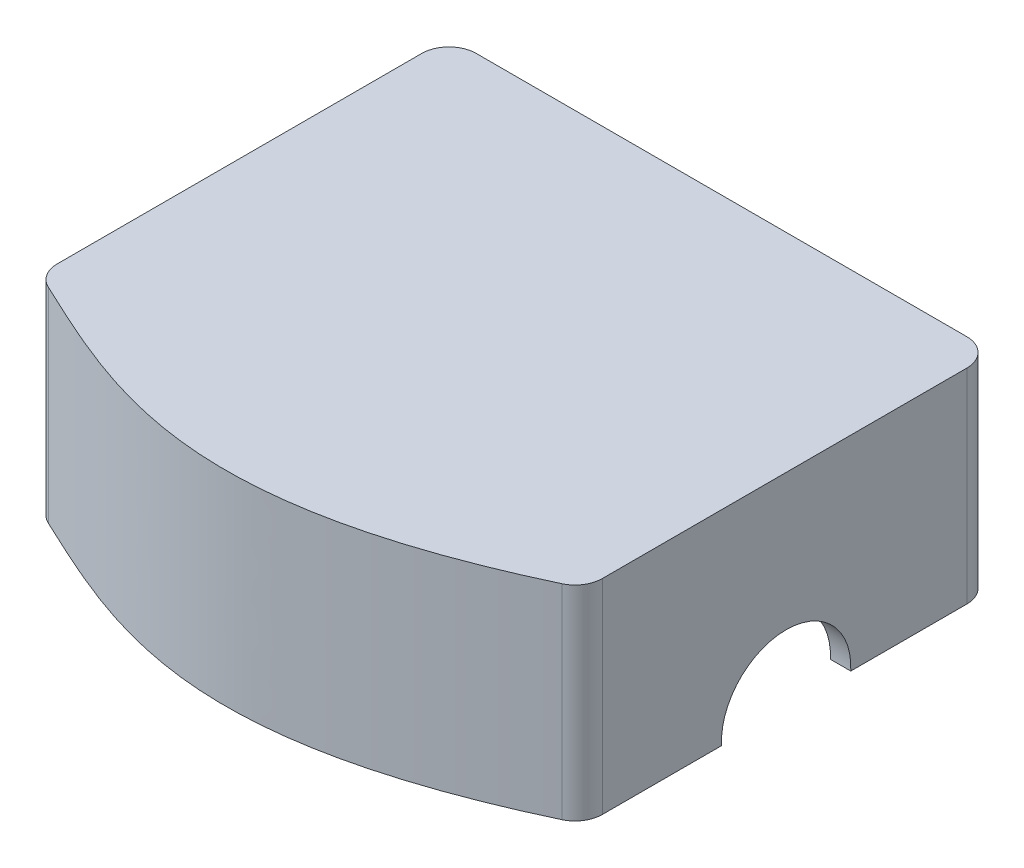
ISO-10303-21;
HEADER;
FILE_DESCRIPTION(('STEP AP214'),'2;1');
FILE_NAME('part.step','',(''),(''),'','','');
FILE_SCHEMA(('AUTOMOTIVE_DESIGN { 1 0 10303 214 1 1 1 1 }'));
ENDSEC;
DATA;
#1=APPLICATION_CONTEXT('core data for automotive mechanical design processes');
#2=APPLICATION_PROTOCOL_DEFINITION('international standard','automotive_design',2000,#1);
#3=PRODUCT_CONTEXT('',#1,'mechanical');
#4=PRODUCT('Part','Part','',(#3));
#5=PRODUCT_RELATED_PRODUCT_CATEGORY('part','',(#4));
#6=PRODUCT_DEFINITION_FORMATION('','',#4);
#7=PRODUCT_DEFINITION_CONTEXT('part definition',#1,'design');
#8=PRODUCT_DEFINITION('design','',#6,#7);
#9=PRODUCT_DEFINITION_SHAPE('','',#8);
#10=(LENGTH_UNIT() NAMED_UNIT(*) SI_UNIT(.MILLI.,.METRE.));
#11=(NAMED_UNIT(*) PLANE_ANGLE_UNIT() SI_UNIT($,.RADIAN.));
#12=(NAMED_UNIT(*) SI_UNIT($,.STERADIAN.) SOLID_ANGLE_UNIT());
#13=UNCERTAINTY_MEASURE_WITH_UNIT(LENGTH_MEASURE(1.E-05),#10,'distance_accuracy_value','');
#14=(GEOMETRIC_REPRESENTATION_CONTEXT(3) GLOBAL_UNCERTAINTY_ASSIGNED_CONTEXT((#13)) GLOBAL_UNIT_ASSIGNED_CONTEXT((#10,
#11,#12)) REPRESENTATION_CONTEXT('',''));
#15=CARTESIAN_POINT('',(0.,0.,0.));
#16=DIRECTION('',(0.,0.,1.));
#17=DIRECTION('',(1.,0.,0.));
#18=AXIS2_PLACEMENT_3D('',#15,#16,#17);
#19=CARTESIAN_POINT('',(200.,150.,-130.));
#20=DIRECTION('',(-1.,0.,0.));
#21=DIRECTION('',(0.,0.,1.));
#22=AXIS2_PLACEMENT_3D('',#19,#20,#21);
#23=PLANE('',#22);
#24=CARTESIAN_POINT('',(200.,2.5,2.57471922172749));
#25=DIRECTION('',(1.,0.,0.));
#26=DIRECTION('',(0.,0.,-1.));
#27=AXIS2_PLACEMENT_3D('',#24,#25,#26);
#28=CIRCLE('',#27,47.5);
#29=CARTESIAN_POINT('',(200.,0.,-44.8594456807982));
#30=VERTEX_POINT('',#29);
#31=CARTESIAN_POINT('',(200.,0.,50.0088841242532));
#32=VERTEX_POINT('',#31);
#33=EDGE_CURVE('E205',#30,#32,#28,.T.);
#34=ORIENTED_EDGE('',*,*,#33,.F.);
#35=DIRECTION('',(0.,0.,-1.));
#36=VECTOR('',#35,1.);
#37=CARTESIAN_POINT('',(200.,0.,-130.));
#38=LINE('',#37,#36);
#39=CARTESIAN_POINT('',(200.,0.,-130.));
#40=VERTEX_POINT('',#39);
#41=EDGE_CURVE('E301',#30,#40,#38,.T.);
#42=ORIENTED_EDGE('',*,*,#41,.T.);
#43=DIRECTION('',(0.,-1.,0.));
#44=VECTOR('',#43,1.);
#45=CARTESIAN_POINT('',(200.,150.,-130.));
#46=LINE('',#45,#44);
#47=CARTESIAN_POINT('',(200.,150.,-130.));
#48=VERTEX_POINT('',#47);
#49=EDGE_CURVE('E239',#48,#40,#46,.T.);
#50=ORIENTED_EDGE('',*,*,#49,.F.);
#51=DIRECTION('',(0.,0.,-1.));
#52=VECTOR('',#51,1.);
#53=CARTESIAN_POINT('',(200.,150.,-130.));
#54=LINE('',#53,#52);
#55=CARTESIAN_POINT('',(200.,150.,137.480797285214));
#56=VERTEX_POINT('',#55);
#57=EDGE_CURVE('E315',#56,#48,#54,.T.);
#58=ORIENTED_EDGE('',*,*,#57,.F.);
#59=DIRECTION('',(0.,-1.,0.));
#60=VECTOR('',#59,1.);
#61=CARTESIAN_POINT('',(200.,150.,137.480797285214));
#62=LINE('',#61,#60);
#63=CARTESIAN_POINT('',(200.,0.,137.480797285214));
#64=VERTEX_POINT('',#63);
#65=EDGE_CURVE('E241',#56,#64,#62,.T.);
#66=ORIENTED_EDGE('',*,*,#65,.T.);
#67=EDGE_CURVE('E309',#64,#32,#38,.T.);
#68=ORIENTED_EDGE('',*,*,#67,.T.);
#69=EDGE_LOOP('',(#34,#42,#50,#58,#66,#68));
#70=FACE_BOUND('',#69,.T.);
#71=ADVANCED_FACE('F44',(#70),#23,.F.);
#72=CARTESIAN_POINT('',(-35.3487619844439,0.,205.553488772592));
#73=DIRECTION('',(0.,-1.,0.));
#74=DIRECTION('',(0.,0.,-1.));
#75=AXIS2_PLACEMENT_3D('',#72,#73,#74);
#76=PLANE('',#75);
#77=DIRECTION('',(1.,0.,0.));
#78=VECTOR('',#77,1.);
#79=CARTESIAN_POINT('',(-200.,0.,-44.8594456807982));
#80=LINE('',#79,#78);
#81=CARTESIAN_POINT('',(-200.,0.,-44.8594456807982));
#82=VERTEX_POINT('',#81);
#83=CARTESIAN_POINT('',(-185.,0.,-44.8594456807982));
#84=VERTEX_POINT('',#83);
#85=EDGE_CURVE('E65',#82,#84,#80,.T.);
#86=ORIENTED_EDGE('',*,*,#85,.F.);
#87=DIRECTION('',(0.,0.,1.));
#88=VECTOR('',#87,1.);
#89=CARTESIAN_POINT('',(-200.,0.,-130.));
#90=LINE('',#89,#88);
#91=CARTESIAN_POINT('',(-200.,0.,-130.));
#92=VERTEX_POINT('',#91);
#93=EDGE_CURVE('E199',#92,#82,#90,.T.);
#94=ORIENTED_EDGE('',*,*,#93,.F.);
#95=CARTESIAN_POINT('',(-180.,0.,-130.));
#96=DIRECTION('',(0.,1.,0.));
#97=DIRECTION('',(0.,0.,1.));
#98=AXIS2_PLACEMENT_3D('',#95,#96,#97);
#99=CIRCLE('',#98,20.);
#100=CARTESIAN_POINT('',(-180.,0.,-150.));
#101=VERTEX_POINT('',#100);
#102=EDGE_CURVE('E207',#101,#92,#99,.T.);
#103=ORIENTED_EDGE('',*,*,#102,.F.);
#104=DIRECTION('',(-1.,0.,0.));
#105=VECTOR('',#104,1.);
#106=CARTESIAN_POINT('',(-180.,0.,-150.));
#107=LINE('',#106,#105);
#108=CARTESIAN_POINT('',(180.,0.,-150.));
#109=VERTEX_POINT('',#108);
#110=EDGE_CURVE('E213',#109,#101,#107,.T.);
#111=ORIENTED_EDGE('',*,*,#110,.F.);
#112=CARTESIAN_POINT('',(180.,0.,-130.));
#113=DIRECTION('',(0.,1.,0.));
#114=DIRECTION('',(0.,0.,-1.));
#115=AXIS2_PLACEMENT_3D('',#112,#113,#114);
#116=CIRCLE('',#115,20.);
#117=EDGE_CURVE('E312',#40,#109,#116,.T.);
#118=ORIENTED_EDGE('',*,*,#117,.F.);
#119=ORIENTED_EDGE('',*,*,#41,.F.);
#120=CARTESIAN_POINT('',(185.,0.,-44.8594456807982));
#121=VERTEX_POINT('',#120);
#122=EDGE_CURVE('E336',#121,#30,#80,.T.);
#123=ORIENTED_EDGE('',*,*,#122,.F.);
#124=DIRECTION('',(0.,0.,1.));
#125=VECTOR('',#124,1.);
#126=CARTESIAN_POINT('',(185.,0.,-130.));
#127=LINE('',#126,#125);
#128=CARTESIAN_POINT('',(185.,0.,-130.));
#129=VERTEX_POINT('',#128);
#130=EDGE_CURVE('E457',#129,#121,#127,.T.);
#131=ORIENTED_EDGE('',*,*,#130,.F.);
#132=CARTESIAN_POINT('',(180.,0.,-130.));
#133=DIRECTION('',(0.,-1.,0.));
#134=DIRECTION('',(0.,0.,-1.));
#135=AXIS2_PLACEMENT_3D('',#132,#133,#134);
#136=CIRCLE('',#135,4.99999999999998);
#137=CARTESIAN_POINT('',(180.,0.,-135.));
#138=VERTEX_POINT('',#137);
#139=EDGE_CURVE('E455',#138,#129,#136,.T.);
#140=ORIENTED_EDGE('',*,*,#139,.F.);
#141=DIRECTION('',(1.,0.,0.));
#142=VECTOR('',#141,1.);
#143=CARTESIAN_POINT('',(-180.,0.,-135.));
#144=LINE('',#143,#142);
#145=CARTESIAN_POINT('',(-180.,0.,-135.));
#146=VERTEX_POINT('',#145);
#147=EDGE_CURVE('E337',#146,#138,#144,.T.);
#148=ORIENTED_EDGE('',*,*,#147,.F.);
#149=CARTESIAN_POINT('',(-180.,0.,-130.));
#150=DIRECTION('',(0.,-1.,0.));
#151=DIRECTION('',(0.,0.,-1.));
#152=AXIS2_PLACEMENT_3D('',#149,#150,#151);
#153=CIRCLE('',#152,4.99999999999998);
#154=CARTESIAN_POINT('',(-185.,0.,-130.));
#155=VERTEX_POINT('',#154);
#156=EDGE_CURVE('E338',#155,#146,#153,.T.);
#157=ORIENTED_EDGE('',*,*,#156,.F.);
#158=DIRECTION('',(0.,0.,-1.));
#159=VECTOR('',#158,1.);
#160=CARTESIAN_POINT('',(-185.,0.,137.480797285215));
#161=LINE('',#160,#159);
#162=EDGE_CURVE('E331',#84,#155,#161,.T.);
#163=ORIENTED_EDGE('',*,*,#162,.F.);
#164=EDGE_LOOP('',(#86,#94,#103,#111,#118,#119,#123,#131,#140,#148,#157,#163));
#165=FACE_BOUND('',#164,.T.);
#166=ADVANCED_FACE('F267',(#165),#76,.T.);
#167=CARTESIAN_POINT('',(-188.5267305837,150.,155.572089819276));
#168=CARTESIAN_POINT('',(-94.2633652918501,150.,200.000000000001));
#169=CARTESIAN_POINT('',(-1.94289029309402E-13,150.,244.427910180726));
#170=CARTESIAN_POINT('',(188.5267305837,150.,155.572089819276));
#171=B_SPLINE_CURVE_WITH_KNOTS('',3,(#167,#168,#169,#170),.UNSPECIFIED.,.F.,.F.,(4,4),(0.,1.),.UNSPECIFIED.);
#172=DIRECTION('',(0.,-1.,0.));
#173=VECTOR('',#172,1.);
#174=SURFACE_OF_LINEAR_EXTRUSION('',#171,#173);
#175=CARTESIAN_POINT('',(-188.5267305837,0.,155.572089819276));
#176=CARTESIAN_POINT('',(-94.2633652918501,0.,200.000000000001));
#177=CARTESIAN_POINT('',(-1.94289029309402E-13,0.,244.427910180726));
#178=CARTESIAN_POINT('',(188.5267305837,0.,155.572089819276));
#179=B_SPLINE_CURVE_WITH_KNOTS('',3,(#175,#176,#177,#178),.UNSPECIFIED.,.F.,.F.,(4,4),(0.,1.),.UNSPECIFIED.);
#180=CARTESIAN_POINT('',(-188.5267305837,0.,155.572089819276));
#181=VERTEX_POINT('',#180);
#182=CARTESIAN_POINT('',(188.5267305837,0.,155.572089819276));
#183=VERTEX_POINT('',#182);
#184=EDGE_CURVE('E308',#181,#183,#179,.T.);
#185=ORIENTED_EDGE('',*,*,#184,.T.);
#186=DIRECTION('',(0.,-1.,0.));
#187=VECTOR('',#186,1.);
#188=CARTESIAN_POINT('',(188.5267305837,150.,155.572089819276));
#189=LINE('',#188,#187);
#190=CARTESIAN_POINT('',(188.5267305837,150.,155.572089819276));
#191=VERTEX_POINT('',#190);
#192=EDGE_CURVE('E54',#191,#183,#189,.T.);
#193=ORIENTED_EDGE('',*,*,#192,.F.);
#194=CARTESIAN_POINT('',(-188.5267305837,150.,155.572089819276));
#195=VERTEX_POINT('',#194);
#196=EDGE_CURVE('E218',#195,#191,#171,.T.);
#197=ORIENTED_EDGE('',*,*,#196,.F.);
#198=DIRECTION('',(0.,-1.,0.));
#199=VECTOR('',#198,1.);
#200=CARTESIAN_POINT('',(-188.5267305837,150.,155.572089819276));
#201=LINE('',#200,#199);
#202=EDGE_CURVE('E219',#195,#181,#201,.T.);
#203=ORIENTED_EDGE('',*,*,#202,.T.);
#204=EDGE_LOOP('',(#185,#193,#197,#203));
#205=FACE_BOUND('',#204,.T.);
#206=ADVANCED_FACE('F50',(#205),#174,.F.);
#207=CARTESIAN_POINT('',(180.,150.,137.480797285215));
#208=DIRECTION('',(0.,-1.,0.));
#209=DIRECTION('',(0.,0.,-1.));
#210=AXIS2_PLACEMENT_3D('',#207,#208,#209);
#211=CYLINDRICAL_SURFACE('',#210,20.);
#212=CARTESIAN_POINT('',(180.,0.,137.480797285215));
#213=DIRECTION('',(0.,1.,0.));
#214=DIRECTION('',(0.,0.,1.));
#215=AXIS2_PLACEMENT_3D('',#212,#213,#214);
#216=CIRCLE('',#215,20.);
#217=EDGE_CURVE('E299',#183,#64,#216,.T.);
#218=ORIENTED_EDGE('',*,*,#217,.T.);
#219=ORIENTED_EDGE('',*,*,#65,.F.);
#220=CARTESIAN_POINT('',(180.,150.,137.480797285215));
#221=DIRECTION('',(0.,1.,0.));
#222=DIRECTION('',(0.,0.,1.));
#223=AXIS2_PLACEMENT_3D('',#220,#221,#222);
#224=CIRCLE('',#223,20.);
#225=EDGE_CURVE('E362',#191,#56,#224,.T.);
#226=ORIENTED_EDGE('',*,*,#225,.F.);
#227=ORIENTED_EDGE('',*,*,#192,.T.);
#228=EDGE_LOOP('',(#218,#219,#226,#227));
#229=FACE_BOUND('',#228,.T.);
#230=ADVANCED_FACE('F288',(#229),#211,.T.);
#231=CARTESIAN_POINT('',(180.,150.,-130.));
#232=DIRECTION('',(0.,-1.,0.));
#233=DIRECTION('',(0.,0.,-1.));
#234=AXIS2_PLACEMENT_3D('',#231,#232,#233);
#235=CYLINDRICAL_SURFACE('',#234,20.);
#236=ORIENTED_EDGE('',*,*,#117,.T.);
#237=DIRECTION('',(0.,-1.,0.));
#238=VECTOR('',#237,1.);
#239=CARTESIAN_POINT('',(180.,150.,-150.));
#240=LINE('',#239,#238);
#241=CARTESIAN_POINT('',(180.,150.,-150.));
#242=VERTEX_POINT('',#241);
#243=EDGE_CURVE('E231',#242,#109,#240,.T.);
#244=ORIENTED_EDGE('',*,*,#243,.F.);
#245=CARTESIAN_POINT('',(180.,150.,-130.));
#246=DIRECTION('',(0.,1.,0.));
#247=DIRECTION('',(0.,0.,-1.));
#248=AXIS2_PLACEMENT_3D('',#245,#246,#247);
#249=CIRCLE('',#248,20.);
#250=EDGE_CURVE('E354',#48,#242,#249,.T.);
#251=ORIENTED_EDGE('',*,*,#250,.F.);
#252=ORIENTED_EDGE('',*,*,#49,.T.);
#253=EDGE_LOOP('',(#236,#244,#251,#252));
#254=FACE_BOUND('',#253,.T.);
#255=ADVANCED_FACE('F284',(#254),#235,.T.);
#256=CARTESIAN_POINT('',(-180.,150.,-150.));
#257=DIRECTION('',(0.,0.,1.));
#258=DIRECTION('',(1.,0.,0.));
#259=AXIS2_PLACEMENT_3D('',#256,#257,#258);
#260=PLANE('',#259);
#261=ORIENTED_EDGE('',*,*,#110,.T.);
#262=DIRECTION('',(0.,-1.,0.));
#263=VECTOR('',#262,1.);
#264=CARTESIAN_POINT('',(-180.,150.,-150.));
#265=LINE('',#264,#263);
#266=CARTESIAN_POINT('',(-180.,150.,-150.));
#267=VERTEX_POINT('',#266);
#268=EDGE_CURVE('E232',#267,#101,#265,.T.);
#269=ORIENTED_EDGE('',*,*,#268,.F.);
#270=DIRECTION('',(-1.,0.,0.));
#271=VECTOR('',#270,1.);
#272=CARTESIAN_POINT('',(-180.,150.,-150.));
#273=LINE('',#272,#271);
#274=EDGE_CURVE('E360',#242,#267,#273,.T.);
#275=ORIENTED_EDGE('',*,*,#274,.F.);
#276=ORIENTED_EDGE('',*,*,#243,.T.);
#277=EDGE_LOOP('',(#261,#269,#275,#276));
#278=FACE_BOUND('',#277,.T.);
#279=ADVANCED_FACE('F278',(#278),#260,.F.);
#280=CARTESIAN_POINT('',(-180.,150.,-130.));
#281=DIRECTION('',(0.,-1.,0.));
#282=DIRECTION('',(0.,0.,-1.));
#283=AXIS2_PLACEMENT_3D('',#280,#281,#282);
#284=CYLINDRICAL_SURFACE('',#283,20.);
#285=ORIENTED_EDGE('',*,*,#102,.T.);
#286=DIRECTION('',(0.,-1.,0.));
#287=VECTOR('',#286,1.);
#288=CARTESIAN_POINT('',(-200.,150.,-130.));
#289=LINE('',#288,#287);
#290=CARTESIAN_POINT('',(-200.,150.,-130.));
#291=VERTEX_POINT('',#290);
#292=EDGE_CURVE('E226',#291,#92,#289,.T.);
#293=ORIENTED_EDGE('',*,*,#292,.F.);
#294=CARTESIAN_POINT('',(-180.,150.,-130.));
#295=DIRECTION('',(0.,1.,0.));
#296=DIRECTION('',(0.,0.,1.));
#297=AXIS2_PLACEMENT_3D('',#294,#295,#296);
#298=CIRCLE('',#297,20.);
#299=EDGE_CURVE('E332',#267,#291,#298,.T.);
#300=ORIENTED_EDGE('',*,*,#299,.F.);
#301=ORIENTED_EDGE('',*,*,#268,.T.);
#302=EDGE_LOOP('',(#285,#293,#300,#301));
#303=FACE_BOUND('',#302,.T.);
#304=ADVANCED_FACE('F280',(#303),#284,.T.);
#305=CARTESIAN_POINT('',(-200.,150.,-130.));
#306=DIRECTION('',(1.,0.,0.));
#307=DIRECTION('',(0.,0.,-1.));
#308=AXIS2_PLACEMENT_3D('',#305,#306,#307);
#309=PLANE('',#308);
#310=ORIENTED_EDGE('',*,*,#93,.T.);
#311=CARTESIAN_POINT('',(-200.,2.5,2.57471922172745));
#312=DIRECTION('',(1.,0.,0.));
#313=DIRECTION('',(0.,0.,-1.));
#314=AXIS2_PLACEMENT_3D('',#311,#312,#313);
#315=CIRCLE('',#314,47.5);
#316=CARTESIAN_POINT('',(-200.,0.,50.0088841242531));
#317=VERTEX_POINT('',#316);
#318=EDGE_CURVE('E184',#82,#317,#315,.T.);
#319=ORIENTED_EDGE('',*,*,#318,.T.);
#320=CARTESIAN_POINT('',(-200.,0.,137.480797285214));
#321=VERTEX_POINT('',#320);
#322=EDGE_CURVE('E198',#317,#321,#90,.T.);
#323=ORIENTED_EDGE('',*,*,#322,.T.);
#324=DIRECTION('',(0.,-1.,0.));
#325=VECTOR('',#324,1.);
#326=CARTESIAN_POINT('',(-200.,150.,137.480797285214));
#327=LINE('',#326,#325);
#328=CARTESIAN_POINT('',(-200.,150.,137.480797285214));
#329=VERTEX_POINT('',#328);
#330=EDGE_CURVE('E221',#329,#321,#327,.T.);
#331=ORIENTED_EDGE('',*,*,#330,.F.);
#332=DIRECTION('',(0.,0.,1.));
#333=VECTOR('',#332,1.);
#334=CARTESIAN_POINT('',(-200.,150.,-130.));
#335=LINE('',#334,#333);
#336=EDGE_CURVE('E366',#291,#329,#335,.T.);
#337=ORIENTED_EDGE('',*,*,#336,.F.);
#338=ORIENTED_EDGE('',*,*,#292,.T.);
#339=EDGE_LOOP('',(#310,#319,#323,#331,#337,#338));
#340=FACE_BOUND('',#339,.T.);
#341=ADVANCED_FACE('F194',(#340),#309,.F.);
#342=CARTESIAN_POINT('',(-180.,150.,137.480797285215));
#343=DIRECTION('',(0.,-1.,0.));
#344=DIRECTION('',(0.,0.,-1.));
#345=AXIS2_PLACEMENT_3D('',#342,#343,#344);
#346=CYLINDRICAL_SURFACE('',#345,20.);
#347=CARTESIAN_POINT('',(-180.,0.,137.480797285215));
#348=DIRECTION('',(0.,1.,0.));
#349=DIRECTION('',(0.,0.,-1.));
#350=AXIS2_PLACEMENT_3D('',#347,#348,#349);
#351=CIRCLE('',#350,20.);
#352=EDGE_CURVE('E210',#321,#181,#351,.T.);
#353=ORIENTED_EDGE('',*,*,#352,.T.);
#354=ORIENTED_EDGE('',*,*,#202,.F.);
#355=CARTESIAN_POINT('',(-180.,150.,137.480797285215));
#356=DIRECTION('',(0.,1.,0.));
#357=DIRECTION('',(0.,0.,-1.));
#358=AXIS2_PLACEMENT_3D('',#355,#356,#357);
#359=CIRCLE('',#358,20.);
#360=EDGE_CURVE('E223',#329,#195,#359,.T.);
#361=ORIENTED_EDGE('',*,*,#360,.F.);
#362=ORIENTED_EDGE('',*,*,#330,.T.);
#363=EDGE_LOOP('',(#353,#354,#361,#362));
#364=FACE_BOUND('',#363,.T.);
#365=ADVANCED_FACE('F271',(#364),#346,.T.);
#366=CARTESIAN_POINT('',(-35.3487619844439,150.,205.553488772592));
#367=DIRECTION('',(0.,-1.,0.));
#368=DIRECTION('',(0.,0.,-1.));
#369=AXIS2_PLACEMENT_3D('',#366,#367,#368);
#370=PLANE('',#369);
#371=ORIENTED_EDGE('',*,*,#196,.T.);
#372=ORIENTED_EDGE('',*,*,#225,.T.);
#373=ORIENTED_EDGE('',*,*,#57,.T.);
#374=ORIENTED_EDGE('',*,*,#250,.T.);
#375=ORIENTED_EDGE('',*,*,#274,.T.);
#376=ORIENTED_EDGE('',*,*,#299,.T.);
#377=ORIENTED_EDGE('',*,*,#336,.T.);
#378=ORIENTED_EDGE('',*,*,#360,.T.);
#379=EDGE_LOOP('',(#371,#372,#373,#374,#375,#376,#377,#378));
#380=FACE_BOUND('',#379,.T.);
#381=ADVANCED_FACE('F268',(#380),#370,.F.);
#382=DIRECTION('',(1.,0.,0.));
#383=VECTOR('',#382,1.);
#384=CARTESIAN_POINT('',(-200.,0.,50.0088841242531));
#385=LINE('',#384,#383);
#386=CARTESIAN_POINT('',(185.,0.,50.0088841242532));
#387=VERTEX_POINT('',#386);
#388=EDGE_CURVE('E66',#32,#387,#385,.F.);
#389=ORIENTED_EDGE('',*,*,#388,.F.);
#390=ORIENTED_EDGE('',*,*,#67,.F.);
#391=ORIENTED_EDGE('',*,*,#217,.F.);
#392=ORIENTED_EDGE('',*,*,#184,.F.);
#393=ORIENTED_EDGE('',*,*,#352,.F.);
#394=ORIENTED_EDGE('',*,*,#322,.F.);
#395=CARTESIAN_POINT('',(-185.,0.,50.0088841242531));
#396=VERTEX_POINT('',#395);
#397=EDGE_CURVE('E182',#396,#317,#385,.F.);
#398=ORIENTED_EDGE('',*,*,#397,.F.);
#399=CARTESIAN_POINT('',(-185.,0.,137.480797285215));
#400=VERTEX_POINT('',#399);
#401=EDGE_CURVE('E386',#400,#396,#161,.T.);
#402=ORIENTED_EDGE('',*,*,#401,.F.);
#403=CARTESIAN_POINT('',(-180.,0.,137.480797285215));
#404=DIRECTION('',(0.,-1.,0.));
#405=DIRECTION('',(0.,0.,-1.));
#406=AXIS2_PLACEMENT_3D('',#403,#404,#405);
#407=CIRCLE('',#406,5.00000000000001);
#408=CARTESIAN_POINT('',(-182.131682645925,0.,142.00362041873));
#409=VERTEX_POINT('',#408);
#410=EDGE_CURVE('E489',#409,#400,#407,.T.);
#411=ORIENTED_EDGE('',*,*,#410,.F.);
#412=CARTESIAN_POINT('',(182.131682645925,0.,142.00362041873));
#413=CARTESIAN_POINT('',(167.75439517496,0.,148.779877922638));
#414=CARTESIAN_POINT('',(153.243793403794,0.,155.096016083903));
#415=CARTESIAN_POINT('',(123.8875449807,0.,166.57192260919));
#416=CARTESIAN_POINT('',(109.042273822971,0.,171.732986949299));
#417=CARTESIAN_POINT('',(86.4513644478745,0.,178.359776109638));
#418=CARTESIAN_POINT('',(78.8669744186296,0.,180.382030951104));
#419=CARTESIAN_POINT('',(63.5743339371536,0.,183.999050287405));
#420=CARTESIAN_POINT('',(55.8660972190431,0.,185.593862184015));
#421=CARTESIAN_POINT('',(40.3071017415332,0.,188.291587149793));
#422=CARTESIAN_POINT('',(32.4563477459489,0.,189.394516660735));
#423=CARTESIAN_POINT('',(20.5568396654547,0.,190.623088760011));
#424=CARTESIAN_POINT('',(16.5697474754844,0.,190.961550457195));
#425=CARTESIAN_POINT('',(8.55133373858154,0.,191.485821190745));
#426=CARTESIAN_POINT('',(4.54423132253058,0.,191.669927655115));
#427=CARTESIAN_POINT('',(-7.45441148750875,0.,191.980616601701));
#428=CARTESIAN_POINT('',(-15.4301895874587,0.,191.865523987644));
#429=CARTESIAN_POINT('',(-31.3332841212342,0.,190.965648075344));
#430=CARTESIAN_POINT('',(-39.260577271752,0.,190.180543025592));
#431=CARTESIAN_POINT('',(-51.114854998834,0.,188.496254108029));
#432=CARTESIAN_POINT('',(-55.060184136374,0.,187.850573319528));
#433=CARTESIAN_POINT('',(-60.9691432313564,0.,186.75720304418));
#434=CARTESIAN_POINT('',(-62.9372916342276,0.,186.371953854018));
#435=CARTESIAN_POINT('',(-66.8706122086859,0.,185.560326999907));
#436=CARTESIAN_POINT('',(-68.836067075517,0.,185.133835789918));
#437=CARTESIAN_POINT('',(-78.6180976652995,0.,182.909176108145));
#438=CARTESIAN_POINT('',(-86.3295421722645,0.,180.827443765919));
#439=CARTESIAN_POINT('',(-101.559170642678,0.,176.152807330847));
#440=CARTESIAN_POINT('',(-109.077405353088,0.,173.56003746309));
#441=CARTESIAN_POINT('',(-123.963089416769,0.,167.975672320305));
#442=CARTESIAN_POINT('',(-131.330609371358,0.,164.984263784895));
#443=CARTESIAN_POINT('',(-153.278917058558,0.,155.602043076827));
#444=CARTESIAN_POINT('',(-167.705359418487,0.,148.802989299762));
#445=CARTESIAN_POINT('',(-182.131682645925,0.,142.00362041873));
#446=B_SPLINE_CURVE_WITH_KNOTS('',3,(#412,#413,#414,#415,#416,#417,#418,#419,#420,#421,#422,
#423,#424,#425,#426,#427,#428,#429,#430,#431,#432,#433,#434,#435,#436,#437,#438,#439,#440,#441,
#442,#443,#444,#445),.UNSPECIFIED.,.F.,.F.,(4,2,2,2,2,2,2,2,2,2,2,2,2,2,2,2,4),(0.,0.125,0.25,
0.3125,0.375,0.4375,0.46875,0.5,0.5625,0.625,0.65625,0.671875,0.6875,0.75,0.8125,0.875,1.),.UNSPECIFIED.);
#447=CARTESIAN_POINT('',(182.131682645925,0.,142.00362041873));
#448=VERTEX_POINT('',#447);
#449=EDGE_CURVE('E255',#448,#409,#446,.T.);
#450=ORIENTED_EDGE('',*,*,#449,.F.);
#451=CARTESIAN_POINT('',(180.,0.,137.480797285215));
#452=DIRECTION('',(0.,-1.,0.));
#453=DIRECTION('',(0.,0.,-1.));
#454=AXIS2_PLACEMENT_3D('',#451,#452,#453);
#455=CIRCLE('',#454,5.);
#456=CARTESIAN_POINT('',(185.,0.,137.480797285214));
#457=VERTEX_POINT('',#456);
#458=EDGE_CURVE('E456',#457,#448,#455,.T.);
#459=ORIENTED_EDGE('',*,*,#458,.F.);
#460=EDGE_CURVE('E451',#387,#457,#127,.T.);
#461=ORIENTED_EDGE('',*,*,#460,.F.);
#462=EDGE_LOOP('',(#389,#390,#391,#392,#393,#394,#398,#402,#411,#450,#459,#461));
#463=FACE_BOUND('',#462,.T.);
#464=ADVANCED_FACE('F202',(#463),#76,.T.);
#465=CARTESIAN_POINT('',(-180.,130.,-130.));
#466=DIRECTION('',(0.,-1.,0.));
#467=DIRECTION('',(0.,0.,-1.));
#468=AXIS2_PLACEMENT_3D('',#465,#466,#467);
#469=CYLINDRICAL_SURFACE('',#468,4.99999999999998);
#470=ORIENTED_EDGE('',*,*,#156,.T.);
#471=DIRECTION('',(0.,-1.,0.));
#472=VECTOR('',#471,1.);
#473=CARTESIAN_POINT('',(-180.,130.,-135.));
#474=LINE('',#473,#472);
#475=CARTESIAN_POINT('',(-180.,130.,-135.));
#476=VERTEX_POINT('',#475);
#477=EDGE_CURVE('E401',#476,#146,#474,.T.);
#478=ORIENTED_EDGE('',*,*,#477,.F.);
#479=CARTESIAN_POINT('',(-180.,130.,-130.));
#480=DIRECTION('',(0.,-1.,0.));
#481=DIRECTION('',(0.,0.,-1.));
#482=AXIS2_PLACEMENT_3D('',#479,#480,#481);
#483=CIRCLE('',#482,4.99999999999998);
#484=CARTESIAN_POINT('',(-185.,130.,-130.));
#485=VERTEX_POINT('',#484);
#486=EDGE_CURVE('E483',#485,#476,#483,.T.);
#487=ORIENTED_EDGE('',*,*,#486,.F.);
#488=DIRECTION('',(0.,-1.,0.));
#489=VECTOR('',#488,1.);
#490=CARTESIAN_POINT('',(-185.,130.,-130.));
#491=LINE('',#490,#489);
#492=EDGE_CURVE('E374',#485,#155,#491,.T.);
#493=ORIENTED_EDGE('',*,*,#492,.T.);
#494=EDGE_LOOP('',(#470,#478,#487,#493));
#495=FACE_BOUND('',#494,.T.);
#496=ADVANCED_FACE('F270',(#495),#469,.F.);
#497=CARTESIAN_POINT('',(-185.,130.,137.480797285215));
#498=DIRECTION('',(-1.,0.,0.));
#499=DIRECTION('',(0.,0.,1.));
#500=AXIS2_PLACEMENT_3D('',#497,#498,#499);
#501=PLANE('',#500);
#502=ORIENTED_EDGE('',*,*,#401,.T.);
#503=CARTESIAN_POINT('',(-185.,2.5,2.57471922172745));
#504=DIRECTION('',(-1.,0.,0.));
#505=DIRECTION('',(0.,0.,1.));
#506=AXIS2_PLACEMENT_3D('',#503,#504,#505);
#507=CIRCLE('',#506,47.5);
#508=EDGE_CURVE('E183',#396,#84,#507,.T.);
#509=ORIENTED_EDGE('',*,*,#508,.T.);
#510=ORIENTED_EDGE('',*,*,#162,.T.);
#511=ORIENTED_EDGE('',*,*,#492,.F.);
#512=DIRECTION('',(0.,0.,-1.));
#513=VECTOR('',#512,1.);
#514=CARTESIAN_POINT('',(-185.,130.,137.480797285215));
#515=LINE('',#514,#513);
#516=CARTESIAN_POINT('',(-185.,130.,137.480797285215));
#517=VERTEX_POINT('',#516);
#518=EDGE_CURVE('E410',#517,#485,#515,.T.);
#519=ORIENTED_EDGE('',*,*,#518,.F.);
#520=DIRECTION('',(0.,-1.,0.));
#521=VECTOR('',#520,1.);
#522=CARTESIAN_POINT('',(-185.,130.,137.480797285215));
#523=LINE('',#522,#521);
#524=EDGE_CURVE('E381',#517,#400,#523,.T.);
#525=ORIENTED_EDGE('',*,*,#524,.T.);
#526=EDGE_LOOP('',(#502,#509,#510,#511,#519,#525));
#527=FACE_BOUND('',#526,.T.);
#528=ADVANCED_FACE('F528',(#527),#501,.F.);
#529=CARTESIAN_POINT('',(-180.,130.,137.480797285215));
#530=DIRECTION('',(0.,-1.,0.));
#531=DIRECTION('',(0.,0.,-1.));
#532=AXIS2_PLACEMENT_3D('',#529,#530,#531);
#533=CYLINDRICAL_SURFACE('',#532,5.00000000000001);
#534=ORIENTED_EDGE('',*,*,#410,.T.);
#535=ORIENTED_EDGE('',*,*,#524,.F.);
#536=CARTESIAN_POINT('',(-180.,130.,137.480797285215));
#537=DIRECTION('',(0.,-1.,0.));
#538=DIRECTION('',(0.,0.,-1.));
#539=AXIS2_PLACEMENT_3D('',#536,#537,#538);
#540=CIRCLE('',#539,5.00000000000001);
#541=CARTESIAN_POINT('',(-182.131682645925,130.,142.00362041873));
#542=VERTEX_POINT('',#541);
#543=EDGE_CURVE('E450',#542,#517,#540,.T.);
#544=ORIENTED_EDGE('',*,*,#543,.F.);
#545=DIRECTION('',(0.,-1.,0.));
#546=VECTOR('',#545,1.);
#547=CARTESIAN_POINT('',(-182.131682645925,130.,142.00362041873));
#548=LINE('',#547,#546);
#549=EDGE_CURVE('E387',#542,#409,#548,.T.);
#550=ORIENTED_EDGE('',*,*,#549,.T.);
#551=EDGE_LOOP('',(#534,#535,#544,#550));
#552=FACE_BOUND('',#551,.T.);
#553=ADVANCED_FACE('F431',(#552),#533,.F.);
#554=CARTESIAN_POINT('',(182.131682645925,130.,142.00362041873));
#555=CARTESIAN_POINT('',(167.75439517496,130.,148.779877922638));
#556=CARTESIAN_POINT('',(153.243793403794,130.,155.096016083903));
#557=CARTESIAN_POINT('',(123.8875449807,130.,166.57192260919));
#558=CARTESIAN_POINT('',(109.042273822971,130.,171.732986949299));
#559=CARTESIAN_POINT('',(86.4513644478745,130.,178.359776109638));
#560=CARTESIAN_POINT('',(78.8669744186296,130.,180.382030951104));
#561=CARTESIAN_POINT('',(63.5743339371536,130.,183.999050287405));
#562=CARTESIAN_POINT('',(55.8660972190431,130.,185.593862184015));
#563=CARTESIAN_POINT('',(40.3071017415332,130.,188.291587149793));
#564=CARTESIAN_POINT('',(32.4563477459489,130.,189.394516660735));
#565=CARTESIAN_POINT('',(20.5568396654547,130.,190.623088760011));
#566=CARTESIAN_POINT('',(16.5697474754844,130.,190.961550457195));
#567=CARTESIAN_POINT('',(8.55133373858154,130.,191.485821190745));
#568=CARTESIAN_POINT('',(4.54423132253058,130.,191.669927655115));
#569=CARTESIAN_POINT('',(-7.45441148750875,130.,191.980616601701));
#570=CARTESIAN_POINT('',(-15.4301895874587,130.,191.865523987644));
#571=CARTESIAN_POINT('',(-31.3332841212342,130.,190.965648075344));
#572=CARTESIAN_POINT('',(-39.260577271752,130.,190.180543025592));
#573=CARTESIAN_POINT('',(-51.114854998834,130.,188.496254108029));
#574=CARTESIAN_POINT('',(-55.060184136374,130.,187.850573319528));
#575=CARTESIAN_POINT('',(-60.9691432313564,130.,186.75720304418));
#576=CARTESIAN_POINT('',(-62.9372916342276,130.,186.371953854018));
#577=CARTESIAN_POINT('',(-66.8706122086859,130.,185.560326999907));
#578=CARTESIAN_POINT('',(-68.836067075517,130.,185.133835789918));
#579=CARTESIAN_POINT('',(-78.6180976652995,130.,182.909176108145));
#580=CARTESIAN_POINT('',(-86.3295421722645,130.,180.827443765919));
#581=CARTESIAN_POINT('',(-101.559170642678,130.,176.152807330847));
#582=CARTESIAN_POINT('',(-109.077405353088,130.,173.56003746309));
#583=CARTESIAN_POINT('',(-123.963089416769,130.,167.975672320305));
#584=CARTESIAN_POINT('',(-131.330609371358,130.,164.984263784895));
#585=CARTESIAN_POINT('',(-153.278917058558,130.,155.602043076827));
#586=CARTESIAN_POINT('',(-167.705359418487,130.,148.802989299762));
#587=CARTESIAN_POINT('',(-182.131682645925,130.,142.00362041873));
#588=B_SPLINE_CURVE_WITH_KNOTS('',3,(#554,#555,#556,#557,#558,#559,#560,#561,#562,#563,#564,
#565,#566,#567,#568,#569,#570,#571,#572,#573,#574,#575,#576,#577,#578,#579,#580,#581,#582,#583,
#584,#585,#586,#587),.UNSPECIFIED.,.F.,.F.,(4,2,2,2,2,2,2,2,2,2,2,2,2,2,2,2,4),(0.,0.125,0.25,
0.3125,0.375,0.4375,0.46875,0.5,0.5625,0.625,0.65625,0.671875,0.6875,0.75,0.8125,0.875,1.),.UNSPECIFIED.);
#589=DIRECTION('',(0.,-1.,0.));
#590=VECTOR('',#589,1.);
#591=SURFACE_OF_LINEAR_EXTRUSION('',#588,#590);
#592=ORIENTED_EDGE('',*,*,#449,.T.);
#593=ORIENTED_EDGE('',*,*,#549,.F.);
#594=CARTESIAN_POINT('',(-182.131682645925,130.,142.00362041873));
#595=CARTESIAN_POINT('',(-167.705359418487,130.,148.802989299762));
#596=CARTESIAN_POINT('',(-153.278917058558,130.,155.602043076827));
#597=CARTESIAN_POINT('',(-131.330609371358,130.,164.984263784895));
#598=CARTESIAN_POINT('',(-123.963089416769,130.,167.975672320305));
#599=CARTESIAN_POINT('',(-109.077405353088,130.,173.56003746309));
#600=CARTESIAN_POINT('',(-101.559170642678,130.,176.152807330847));
#601=CARTESIAN_POINT('',(-86.3295421722645,130.,180.827443765919));
#602=CARTESIAN_POINT('',(-78.6180976652995,130.,182.909176108145));
#603=CARTESIAN_POINT('',(-68.836067075517,130.,185.133835789918));
#604=CARTESIAN_POINT('',(-66.8706122086859,130.,185.560326999907));
#605=CARTESIAN_POINT('',(-62.9372916342276,130.,186.371953854018));
#606=CARTESIAN_POINT('',(-60.9691432313564,130.,186.75720304418));
#607=CARTESIAN_POINT('',(-55.060184136374,130.,187.850573319528));
#608=CARTESIAN_POINT('',(-51.114854998834,130.,188.496254108029));
#609=CARTESIAN_POINT('',(-39.260577271752,130.,190.180543025592));
#610=CARTESIAN_POINT('',(-31.3332841212342,130.,190.965648075344));
#611=CARTESIAN_POINT('',(-15.4301895874587,130.,191.865523987644));
#612=CARTESIAN_POINT('',(-7.45441148750875,130.,191.980616601701));
#613=CARTESIAN_POINT('',(4.54423132253058,130.,191.669927655115));
#614=CARTESIAN_POINT('',(8.55133373858154,130.,191.485821190745));
#615=CARTESIAN_POINT('',(16.5697474754844,130.,190.961550457195));
#616=CARTESIAN_POINT('',(20.5568396654547,130.,190.623088760011));
#617=CARTESIAN_POINT('',(32.4563477459489,130.,189.394516660735));
#618=CARTESIAN_POINT('',(40.3071017415332,130.,188.291587149793));
#619=CARTESIAN_POINT('',(55.8660972190431,130.,185.593862184015));
#620=CARTESIAN_POINT('',(63.5743339371536,130.,183.999050287405));
#621=CARTESIAN_POINT('',(78.8669744186296,130.,180.382030951104));
#622=CARTESIAN_POINT('',(86.4513644478745,130.,178.359776109638));
#623=CARTESIAN_POINT('',(109.042273822971,130.,171.732986949299));
#624=CARTESIAN_POINT('',(123.8875449807,130.,166.57192260919));
#625=CARTESIAN_POINT('',(153.243793403794,130.,155.096016083903));
#626=CARTESIAN_POINT('',(167.75439517496,130.,148.779877922638));
#627=CARTESIAN_POINT('',(182.131682645925,130.,142.00362041873));
#628=B_SPLINE_CURVE_WITH_KNOTS('',3,(#594,#595,#596,#597,#598,#599,#600,#601,#602,#603,#604,
#605,#606,#607,#608,#609,#610,#611,#612,#613,#614,#615,#616,#617,#618,#619,#620,#621,#622,#623,
#624,#625,#626,#627),.UNSPECIFIED.,.F.,.F.,(4,2,2,2,2,2,2,2,2,2,2,2,2,2,2,2,4),(0.,0.125,0.1875,
0.25,0.3125,0.328125,0.34375,0.375,0.4375,0.5,0.53125,0.5625,0.625,0.6875,0.75,0.875,1.),.UNSPECIFIED.);
#629=CARTESIAN_POINT('',(182.131682645925,130.,142.00362041873));
#630=VERTEX_POINT('',#629);
#631=EDGE_CURVE('E415',#630,#542,#628,.F.);
#632=ORIENTED_EDGE('',*,*,#631,.F.);
#633=DIRECTION('',(0.,-1.,0.));
#634=VECTOR('',#633,1.);
#635=CARTESIAN_POINT('',(182.131682645925,130.,142.00362041873));
#636=LINE('',#635,#634);
#637=EDGE_CURVE('E397',#630,#448,#636,.T.);
#638=ORIENTED_EDGE('',*,*,#637,.T.);
#639=EDGE_LOOP('',(#592,#593,#632,#638));
#640=FACE_BOUND('',#639,.T.);
#641=ADVANCED_FACE('F420',(#640),#591,.F.);
#642=CARTESIAN_POINT('',(180.,130.,137.480797285215));
#643=DIRECTION('',(0.,-1.,0.));
#644=DIRECTION('',(0.,0.,-1.));
#645=AXIS2_PLACEMENT_3D('',#642,#643,#644);
#646=CYLINDRICAL_SURFACE('',#645,5.);
#647=ORIENTED_EDGE('',*,*,#458,.T.);
#648=ORIENTED_EDGE('',*,*,#637,.F.);
#649=CARTESIAN_POINT('',(180.,130.,137.480797285215));
#650=DIRECTION('',(0.,-1.,0.));
#651=DIRECTION('',(0.,0.,-1.));
#652=AXIS2_PLACEMENT_3D('',#649,#650,#651);
#653=CIRCLE('',#652,5.);
#654=CARTESIAN_POINT('',(185.,130.,137.480797285214));
#655=VERTEX_POINT('',#654);
#656=EDGE_CURVE('E468',#655,#630,#653,.T.);
#657=ORIENTED_EDGE('',*,*,#656,.F.);
#658=DIRECTION('',(0.,-1.,0.));
#659=VECTOR('',#658,1.);
#660=CARTESIAN_POINT('',(185.,130.,137.480797285214));
#661=LINE('',#660,#659);
#662=EDGE_CURVE('E395',#655,#457,#661,.T.);
#663=ORIENTED_EDGE('',*,*,#662,.T.);
#664=EDGE_LOOP('',(#647,#648,#657,#663));
#665=FACE_BOUND('',#664,.T.);
#666=ADVANCED_FACE('F429',(#665),#646,.F.);
#667=CARTESIAN_POINT('',(185.,130.,-130.));
#668=DIRECTION('',(1.,0.,0.));
#669=DIRECTION('',(0.,0.,-1.));
#670=AXIS2_PLACEMENT_3D('',#667,#668,#669);
#671=PLANE('',#670);
#672=ORIENTED_EDGE('',*,*,#130,.T.);
#673=CARTESIAN_POINT('',(185.,2.5,2.57471922172749));
#674=DIRECTION('',(1.,0.,0.));
#675=DIRECTION('',(0.,0.,-1.));
#676=AXIS2_PLACEMENT_3D('',#673,#674,#675);
#677=CIRCLE('',#676,47.5);
#678=EDGE_CURVE('E11',#121,#387,#677,.T.);
#679=ORIENTED_EDGE('',*,*,#678,.T.);
#680=ORIENTED_EDGE('',*,*,#460,.T.);
#681=ORIENTED_EDGE('',*,*,#662,.F.);
#682=DIRECTION('',(0.,0.,1.));
#683=VECTOR('',#682,1.);
#684=CARTESIAN_POINT('',(185.,130.,-130.));
#685=LINE('',#684,#683);
#686=CARTESIAN_POINT('',(185.,130.,-130.));
#687=VERTEX_POINT('',#686);
#688=EDGE_CURVE('E439',#687,#655,#685,.T.);
#689=ORIENTED_EDGE('',*,*,#688,.F.);
#690=DIRECTION('',(0.,-1.,0.));
#691=VECTOR('',#690,1.);
#692=CARTESIAN_POINT('',(185.,130.,-130.));
#693=LINE('',#692,#691);
#694=EDGE_CURVE('E400',#687,#129,#693,.T.);
#695=ORIENTED_EDGE('',*,*,#694,.T.);
#696=EDGE_LOOP('',(#672,#679,#680,#681,#689,#695));
#697=FACE_BOUND('',#696,.T.);
#698=ADVANCED_FACE('F464',(#697),#671,.F.);
#699=CARTESIAN_POINT('',(180.,130.,-130.));
#700=DIRECTION('',(0.,-1.,0.));
#701=DIRECTION('',(0.,0.,-1.));
#702=AXIS2_PLACEMENT_3D('',#699,#700,#701);
#703=CYLINDRICAL_SURFACE('',#702,4.99999999999998);
#704=ORIENTED_EDGE('',*,*,#139,.T.);
#705=ORIENTED_EDGE('',*,*,#694,.F.);
#706=CARTESIAN_POINT('',(180.,130.,-130.));
#707=DIRECTION('',(0.,-1.,0.));
#708=DIRECTION('',(0.,0.,-1.));
#709=AXIS2_PLACEMENT_3D('',#706,#707,#708);
#710=CIRCLE('',#709,4.99999999999998);
#711=CARTESIAN_POINT('',(180.,130.,-135.));
#712=VERTEX_POINT('',#711);
#713=EDGE_CURVE('E476',#712,#687,#710,.T.);
#714=ORIENTED_EDGE('',*,*,#713,.F.);
#715=DIRECTION('',(0.,-1.,0.));
#716=VECTOR('',#715,1.);
#717=CARTESIAN_POINT('',(180.,130.,-135.));
#718=LINE('',#717,#716);
#719=EDGE_CURVE('E396',#712,#138,#718,.T.);
#720=ORIENTED_EDGE('',*,*,#719,.T.);
#721=EDGE_LOOP('',(#704,#705,#714,#720));
#722=FACE_BOUND('',#721,.T.);
#723=ADVANCED_FACE('F548',(#722),#703,.F.);
#724=CARTESIAN_POINT('',(-180.,130.,-135.));
#725=DIRECTION('',(0.,0.,-1.));
#726=DIRECTION('',(-1.,0.,0.));
#727=AXIS2_PLACEMENT_3D('',#724,#725,#726);
#728=PLANE('',#727);
#729=ORIENTED_EDGE('',*,*,#147,.T.);
#730=ORIENTED_EDGE('',*,*,#719,.F.);
#731=DIRECTION('',(1.,0.,0.));
#732=VECTOR('',#731,1.);
#733=CARTESIAN_POINT('',(-180.,130.,-135.));
#734=LINE('',#733,#732);
#735=EDGE_CURVE('E481',#476,#712,#734,.T.);
#736=ORIENTED_EDGE('',*,*,#735,.F.);
#737=ORIENTED_EDGE('',*,*,#477,.T.);
#738=EDGE_LOOP('',(#729,#730,#736,#737));
#739=FACE_BOUND('',#738,.T.);
#740=ADVANCED_FACE('F554',(#739),#728,.F.);
#741=CARTESIAN_POINT('',(-180.,130.,-130.));
#742=DIRECTION('',(0.,-1.,0.));
#743=DIRECTION('',(0.,0.,-1.));
#744=AXIS2_PLACEMENT_3D('',#741,#742,#743);
#745=PLANE('',#744);
#746=ORIENTED_EDGE('',*,*,#486,.T.);
#747=ORIENTED_EDGE('',*,*,#735,.T.);
#748=ORIENTED_EDGE('',*,*,#713,.T.);
#749=ORIENTED_EDGE('',*,*,#688,.T.);
#750=ORIENTED_EDGE('',*,*,#656,.T.);
#751=ORIENTED_EDGE('',*,*,#631,.T.);
#752=ORIENTED_EDGE('',*,*,#543,.T.);
#753=ORIENTED_EDGE('',*,*,#518,.T.);
#754=EDGE_LOOP('',(#746,#747,#748,#749,#750,#751,#752,#753));
#755=FACE_BOUND('',#754,.T.);
#756=ADVANCED_FACE('F474',(#755),#745,.T.);
#757=CARTESIAN_POINT('',(-200.,2.5,2.57471922172745));
#758=DIRECTION('',(1.,0.,0.));
#759=DIRECTION('',(0.,0.,-1.));
#760=AXIS2_PLACEMENT_3D('',#757,#758,#759);
#761=CYLINDRICAL_SURFACE('',#760,47.5);
#762=ORIENTED_EDGE('',*,*,#122,.T.);
#763=ORIENTED_EDGE('',*,*,#33,.T.);
#764=ORIENTED_EDGE('',*,*,#388,.T.);
#765=ORIENTED_EDGE('',*,*,#678,.F.);
#766=EDGE_LOOP('',(#762,#763,#764,#765));
#767=FACE_BOUND('',#766,.T.);
#768=ADVANCED_FACE('F349',(#767),#761,.F.);
#769=ORIENTED_EDGE('',*,*,#85,.T.);
#770=ORIENTED_EDGE('',*,*,#508,.F.);
#771=ORIENTED_EDGE('',*,*,#397,.T.);
#772=ORIENTED_EDGE('',*,*,#318,.F.);
#773=EDGE_LOOP('',(#769,#770,#771,#772));
#774=FACE_BOUND('',#773,.T.);
#775=ADVANCED_FACE('F181',(#774),#761,.F.);
#776=CLOSED_SHELL('',(#71,#166,#206,#230,#255,#279,#304,#341,#365,#381,#464,#496,#528,#553,#641,
#666,#698,#723,#740,#756,#768,#775));
#777=MANIFOLD_SOLID_BREP('B2',#776);
#778=ADVANCED_BREP_SHAPE_REPRESENTATION('',(#18,#777),#14);
#779=SHAPE_DEFINITION_REPRESENTATION(#9,#778);
ENDSEC;
END-ISO-10303-21;
